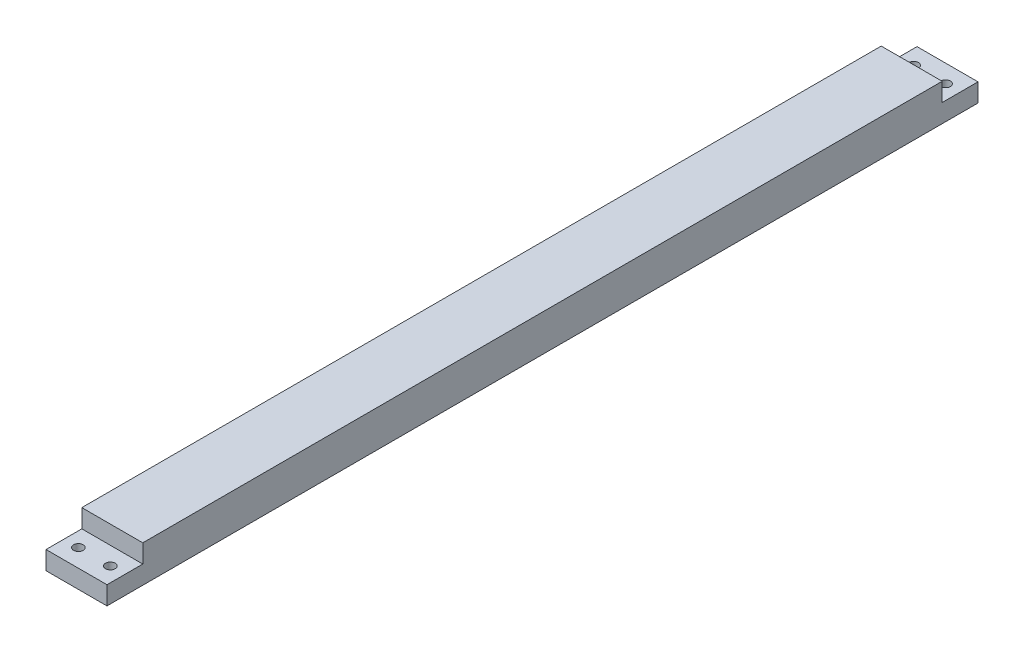
ISO-10303-21;
HEADER;
FILE_DESCRIPTION(('STEP AP214'),'2;1');
FILE_NAME('part.step','',(''),(''),'','','');
FILE_SCHEMA(('AUTOMOTIVE_DESIGN { 1 0 10303 214 1 1 1 1 }'));
ENDSEC;
DATA;
#1=APPLICATION_CONTEXT('core data for automotive mechanical design processes');
#2=APPLICATION_PROTOCOL_DEFINITION('international standard','automotive_design',2000,#1);
#3=PRODUCT_CONTEXT('',#1,'mechanical');
#4=PRODUCT('Part','Part','',(#3));
#5=PRODUCT_RELATED_PRODUCT_CATEGORY('part','',(#4));
#6=PRODUCT_DEFINITION_FORMATION('','',#4);
#7=PRODUCT_DEFINITION_CONTEXT('part definition',#1,'design');
#8=PRODUCT_DEFINITION('design','',#6,#7);
#9=PRODUCT_DEFINITION_SHAPE('','',#8);
#10=(LENGTH_UNIT() NAMED_UNIT(*) SI_UNIT(.MILLI.,.METRE.));
#11=(NAMED_UNIT(*) PLANE_ANGLE_UNIT() SI_UNIT($,.RADIAN.));
#12=(NAMED_UNIT(*) SI_UNIT($,.STERADIAN.) SOLID_ANGLE_UNIT());
#13=UNCERTAINTY_MEASURE_WITH_UNIT(LENGTH_MEASURE(1.E-05),#10,'distance_accuracy_value','');
#14=(GEOMETRIC_REPRESENTATION_CONTEXT(3) GLOBAL_UNCERTAINTY_ASSIGNED_CONTEXT((#13)) GLOBAL_UNIT_ASSIGNED_CONTEXT((#10,
#11,#12)) REPRESENTATION_CONTEXT('',''));
#15=CARTESIAN_POINT('',(0.,0.,0.));
#16=DIRECTION('',(0.,0.,1.));
#17=DIRECTION('',(1.,0.,0.));
#18=AXIS2_PLACEMENT_3D('',#15,#16,#17);
#19=CARTESIAN_POINT('',(0.,0.,900.));
#20=DIRECTION('',(1.,0.,0.));
#21=DIRECTION('',(0.,0.,-1.));
#22=AXIS2_PLACEMENT_3D('',#19,#20,#21);
#23=PLANE('',#22);
#24=DIRECTION('',(0.,-1.,0.));
#25=VECTOR('',#24,1.);
#26=CARTESIAN_POINT('',(0.,0.,900.));
#27=LINE('',#26,#25);
#28=CARTESIAN_POINT('',(0.,19.,900.));
#29=VERTEX_POINT('',#28);
#30=CARTESIAN_POINT('',(0.,0.,900.));
#31=VERTEX_POINT('',#30);
#32=EDGE_CURVE('E129',#29,#31,#27,.T.);
#33=ORIENTED_EDGE('',*,*,#32,.F.);
#34=DIRECTION('',(0.,0.,1.));
#35=VECTOR('',#34,1.);
#36=CARTESIAN_POINT('',(0.,19.,900.));
#37=LINE('',#36,#35);
#38=CARTESIAN_POINT('',(0.,19.,863.));
#39=VERTEX_POINT('',#38);
#40=EDGE_CURVE('E47',#39,#29,#37,.T.);
#41=ORIENTED_EDGE('',*,*,#40,.F.);
#42=DIRECTION('',(0.,-1.,0.));
#43=VECTOR('',#42,1.);
#44=CARTESIAN_POINT('',(0.,38.,863.));
#45=LINE('',#44,#43);
#46=CARTESIAN_POINT('',(0.,38.,863.));
#47=VERTEX_POINT('',#46);
#48=EDGE_CURVE('E157',#47,#39,#45,.T.);
#49=ORIENTED_EDGE('',*,*,#48,.F.);
#50=DIRECTION('',(0.,0.,-1.));
#51=VECTOR('',#50,1.);
#52=CARTESIAN_POINT('',(0.,38.,900.));
#53=LINE('',#52,#51);
#54=CARTESIAN_POINT('',(0.,38.,37.));
#55=VERTEX_POINT('',#54);
#56=EDGE_CURVE('E115',#47,#55,#53,.T.);
#57=ORIENTED_EDGE('',*,*,#56,.T.);
#58=DIRECTION('',(0.,1.,0.));
#59=VECTOR('',#58,1.);
#60=CARTESIAN_POINT('',(0.,38.,37.));
#61=LINE('',#60,#59);
#62=CARTESIAN_POINT('',(0.,19.,37.));
#63=VERTEX_POINT('',#62);
#64=EDGE_CURVE('E145',#63,#55,#61,.T.);
#65=ORIENTED_EDGE('',*,*,#64,.F.);
#66=DIRECTION('',(0.,0.,1.));
#67=VECTOR('',#66,1.);
#68=CARTESIAN_POINT('',(0.,19.,0.));
#69=LINE('',#68,#67);
#70=CARTESIAN_POINT('',(0.,19.,0.));
#71=VERTEX_POINT('',#70);
#72=EDGE_CURVE('E148',#71,#63,#69,.T.);
#73=ORIENTED_EDGE('',*,*,#72,.F.);
#74=DIRECTION('',(0.,-1.,0.));
#75=VECTOR('',#74,1.);
#76=CARTESIAN_POINT('',(0.,0.,0.));
#77=LINE('',#76,#75);
#78=CARTESIAN_POINT('',(0.,0.,0.));
#79=VERTEX_POINT('',#78);
#80=EDGE_CURVE('E132',#71,#79,#77,.T.);
#81=ORIENTED_EDGE('',*,*,#80,.T.);
#82=DIRECTION('',(0.,0.,-1.));
#83=VECTOR('',#82,1.);
#84=CARTESIAN_POINT('',(0.,0.,900.));
#85=LINE('',#84,#83);
#86=EDGE_CURVE('E11',#31,#79,#85,.T.);
#87=ORIENTED_EDGE('',*,*,#86,.F.);
#88=EDGE_LOOP('',(#33,#41,#49,#57,#65,#73,#81,#87));
#89=FACE_BOUND('',#88,.T.);
#90=ADVANCED_FACE('F33',(#89),#23,.F.);
#91=CARTESIAN_POINT('',(0.,0.,900.));
#92=DIRECTION('',(0.,1.,0.));
#93=DIRECTION('',(0.,0.,1.));
#94=AXIS2_PLACEMENT_3D('',#91,#92,#93);
#95=PLANE('',#94);
#96=CARTESIAN_POINT('',(48.,0.,18.5));
#97=DIRECTION('',(0.,1.,0.));
#98=DIRECTION('',(0.,0.,-1.));
#99=AXIS2_PLACEMENT_3D('',#96,#97,#98);
#100=CIRCLE('',#99,5.);
#101=CARTESIAN_POINT('',(48.,0.,13.5));
#102=VERTEX_POINT('',#101);
#103=EDGE_CURVE('E164',#102,#102,#100,.T.);
#104=ORIENTED_EDGE('',*,*,#103,.T.);
#105=EDGE_LOOP('',(#104));
#106=FACE_BOUND('',#105,.T.);
#107=CARTESIAN_POINT('',(47.9999999999999,0.,881.5));
#108=DIRECTION('',(0.,1.,0.));
#109=DIRECTION('',(0.,0.,1.));
#110=AXIS2_PLACEMENT_3D('',#107,#108,#109);
#111=CIRCLE('',#110,5.00000000000001);
#112=CARTESIAN_POINT('',(47.9999999999999,0.,886.5));
#113=VERTEX_POINT('',#112);
#114=EDGE_CURVE('E176',#113,#113,#111,.T.);
#115=ORIENTED_EDGE('',*,*,#114,.T.);
#116=EDGE_LOOP('',(#115));
#117=FACE_BOUND('',#116,.T.);
#118=CARTESIAN_POINT('',(15.0000000000001,0.,881.5));
#119=DIRECTION('',(0.,1.,0.));
#120=DIRECTION('',(0.,0.,-1.));
#121=AXIS2_PLACEMENT_3D('',#118,#119,#120);
#122=CIRCLE('',#121,5.00000000000001);
#123=CARTESIAN_POINT('',(15.0000000000001,0.,876.5));
#124=VERTEX_POINT('',#123);
#125=EDGE_CURVE('E170',#124,#124,#122,.T.);
#126=ORIENTED_EDGE('',*,*,#125,.T.);
#127=EDGE_LOOP('',(#126));
#128=FACE_BOUND('',#127,.T.);
#129=CARTESIAN_POINT('',(15.,0.,18.5));
#130=DIRECTION('',(0.,1.,0.));
#131=DIRECTION('',(0.,0.,1.));
#132=AXIS2_PLACEMENT_3D('',#129,#130,#131);
#133=CIRCLE('',#132,5.);
#134=CARTESIAN_POINT('',(15.,0.,23.5));
#135=VERTEX_POINT('',#134);
#136=EDGE_CURVE('E159',#135,#135,#133,.T.);
#137=ORIENTED_EDGE('',*,*,#136,.T.);
#138=EDGE_LOOP('',(#137));
#139=FACE_BOUND('',#138,.T.);
#140=DIRECTION('',(1.,0.,0.));
#141=VECTOR('',#140,1.);
#142=CARTESIAN_POINT('',(0.,0.,0.));
#143=LINE('',#142,#141);
#144=CARTESIAN_POINT('',(63.,0.,0.));
#145=VERTEX_POINT('',#144);
#146=EDGE_CURVE('E130',#79,#145,#143,.T.);
#147=ORIENTED_EDGE('',*,*,#146,.T.);
#148=DIRECTION('',(0.,0.,-1.));
#149=VECTOR('',#148,1.);
#150=CARTESIAN_POINT('',(63.,0.,900.));
#151=LINE('',#150,#149);
#152=CARTESIAN_POINT('',(63.,0.,900.));
#153=VERTEX_POINT('',#152);
#154=EDGE_CURVE('E40',#153,#145,#151,.T.);
#155=ORIENTED_EDGE('',*,*,#154,.F.);
#156=DIRECTION('',(1.,0.,0.));
#157=VECTOR('',#156,1.);
#158=CARTESIAN_POINT('',(0.,0.,900.));
#159=LINE('',#158,#157);
#160=EDGE_CURVE('E137',#31,#153,#159,.T.);
#161=ORIENTED_EDGE('',*,*,#160,.F.);
#162=ORIENTED_EDGE('',*,*,#86,.T.);
#163=EDGE_LOOP('',(#147,#155,#161,#162));
#164=FACE_BOUND('',#163,.T.);
#165=ADVANCED_FACE('F185',(#106,#117,#128,#139,#164),#95,.F.);
#166=CARTESIAN_POINT('',(63.,0.,900.));
#167=DIRECTION('',(-1.,0.,0.));
#168=DIRECTION('',(0.,0.,1.));
#169=AXIS2_PLACEMENT_3D('',#166,#167,#168);
#170=PLANE('',#169);
#171=DIRECTION('',(0.,-1.,0.));
#172=VECTOR('',#171,1.);
#173=CARTESIAN_POINT('',(63.,38.,863.));
#174=LINE('',#173,#172);
#175=CARTESIAN_POINT('',(63.,38.,863.));
#176=VERTEX_POINT('',#175);
#177=CARTESIAN_POINT('',(63.,19.,863.));
#178=VERTEX_POINT('',#177);
#179=EDGE_CURVE('E96',#176,#178,#174,.T.);
#180=ORIENTED_EDGE('',*,*,#179,.T.);
#181=DIRECTION('',(0.,0.,1.));
#182=VECTOR('',#181,1.);
#183=CARTESIAN_POINT('',(63.,19.,900.));
#184=LINE('',#183,#182);
#185=CARTESIAN_POINT('',(63.,19.,900.));
#186=VERTEX_POINT('',#185);
#187=EDGE_CURVE('E107',#178,#186,#184,.T.);
#188=ORIENTED_EDGE('',*,*,#187,.T.);
#189=DIRECTION('',(0.,1.,0.));
#190=VECTOR('',#189,1.);
#191=CARTESIAN_POINT('',(63.,0.,900.));
#192=LINE('',#191,#190);
#193=EDGE_CURVE('E123',#153,#186,#192,.T.);
#194=ORIENTED_EDGE('',*,*,#193,.F.);
#195=ORIENTED_EDGE('',*,*,#154,.T.);
#196=DIRECTION('',(0.,1.,0.));
#197=VECTOR('',#196,1.);
#198=CARTESIAN_POINT('',(63.,0.,0.));
#199=LINE('',#198,#197);
#200=CARTESIAN_POINT('',(63.,19.,0.));
#201=VERTEX_POINT('',#200);
#202=EDGE_CURVE('E126',#145,#201,#199,.T.);
#203=ORIENTED_EDGE('',*,*,#202,.T.);
#204=DIRECTION('',(0.,0.,1.));
#205=VECTOR('',#204,1.);
#206=CARTESIAN_POINT('',(63.,19.,0.));
#207=LINE('',#206,#205);
#208=CARTESIAN_POINT('',(63.,19.,37.));
#209=VERTEX_POINT('',#208);
#210=EDGE_CURVE('E55',#201,#209,#207,.T.);
#211=ORIENTED_EDGE('',*,*,#210,.T.);
#212=DIRECTION('',(0.,1.,0.));
#213=VECTOR('',#212,1.);
#214=CARTESIAN_POINT('',(63.,38.,37.));
#215=LINE('',#214,#213);
#216=CARTESIAN_POINT('',(63.,38.,37.));
#217=VERTEX_POINT('',#216);
#218=EDGE_CURVE('E120',#209,#217,#215,.T.);
#219=ORIENTED_EDGE('',*,*,#218,.T.);
#220=DIRECTION('',(0.,0.,-1.));
#221=VECTOR('',#220,1.);
#222=CARTESIAN_POINT('',(63.,38.,900.));
#223=LINE('',#222,#221);
#224=EDGE_CURVE('E113',#176,#217,#223,.T.);
#225=ORIENTED_EDGE('',*,*,#224,.F.);
#226=EDGE_LOOP('',(#180,#188,#194,#195,#203,#211,#219,#225));
#227=FACE_BOUND('',#226,.T.);
#228=ADVANCED_FACE('F118',(#227),#170,.F.);
#229=CARTESIAN_POINT('',(0.,38.,900.));
#230=DIRECTION('',(0.,-1.,0.));
#231=DIRECTION('',(0.,0.,-1.));
#232=AXIS2_PLACEMENT_3D('',#229,#230,#231);
#233=PLANE('',#232);
#234=ORIENTED_EDGE('',*,*,#56,.F.);
#235=DIRECTION('',(-1.,0.,0.));
#236=VECTOR('',#235,1.);
#237=CARTESIAN_POINT('',(63.,38.,863.));
#238=LINE('',#237,#236);
#239=EDGE_CURVE('E100',#176,#47,#238,.T.);
#240=ORIENTED_EDGE('',*,*,#239,.F.);
#241=ORIENTED_EDGE('',*,*,#224,.T.);
#242=DIRECTION('',(-1.,0.,0.));
#243=VECTOR('',#242,1.);
#244=CARTESIAN_POINT('',(63.,38.,37.));
#245=LINE('',#244,#243);
#246=EDGE_CURVE('E134',#217,#55,#245,.T.);
#247=ORIENTED_EDGE('',*,*,#246,.T.);
#248=EDGE_LOOP('',(#234,#240,#241,#247));
#249=FACE_BOUND('',#248,.T.);
#250=ADVANCED_FACE('F111',(#249),#233,.F.);
#251=CARTESIAN_POINT('',(0.,0.,900.));
#252=DIRECTION('',(0.,0.,-1.));
#253=DIRECTION('',(-1.,0.,0.));
#254=AXIS2_PLACEMENT_3D('',#251,#252,#253);
#255=PLANE('',#254);
#256=ORIENTED_EDGE('',*,*,#193,.T.);
#257=DIRECTION('',(-1.,0.,0.));
#258=VECTOR('',#257,1.);
#259=CARTESIAN_POINT('',(63.,19.,900.));
#260=LINE('',#259,#258);
#261=EDGE_CURVE('E151',#186,#29,#260,.T.);
#262=ORIENTED_EDGE('',*,*,#261,.T.);
#263=ORIENTED_EDGE('',*,*,#32,.T.);
#264=ORIENTED_EDGE('',*,*,#160,.T.);
#265=EDGE_LOOP('',(#256,#262,#263,#264));
#266=FACE_BOUND('',#265,.T.);
#267=ADVANCED_FACE('F218',(#266),#255,.F.);
#268=CARTESIAN_POINT('',(0.,0.,0.));
#269=DIRECTION('',(0.,0.,-1.));
#270=DIRECTION('',(-1.,0.,0.));
#271=AXIS2_PLACEMENT_3D('',#268,#269,#270);
#272=PLANE('',#271);
#273=DIRECTION('',(-1.,0.,0.));
#274=VECTOR('',#273,1.);
#275=CARTESIAN_POINT('',(63.,19.,0.));
#276=LINE('',#275,#274);
#277=EDGE_CURVE('E140',#201,#71,#276,.T.);
#278=ORIENTED_EDGE('',*,*,#277,.F.);
#279=ORIENTED_EDGE('',*,*,#202,.F.);
#280=ORIENTED_EDGE('',*,*,#146,.F.);
#281=ORIENTED_EDGE('',*,*,#80,.F.);
#282=EDGE_LOOP('',(#278,#279,#280,#281));
#283=FACE_BOUND('',#282,.T.);
#284=ADVANCED_FACE('F213',(#283),#272,.T.);
#285=CARTESIAN_POINT('',(63.,38.,37.));
#286=DIRECTION('',(0.,0.,1.));
#287=DIRECTION('',(0.,-1.,0.));
#288=AXIS2_PLACEMENT_3D('',#285,#286,#287);
#289=PLANE('',#288);
#290=ORIENTED_EDGE('',*,*,#64,.T.);
#291=ORIENTED_EDGE('',*,*,#246,.F.);
#292=ORIENTED_EDGE('',*,*,#218,.F.);
#293=DIRECTION('',(-1.,0.,0.));
#294=VECTOR('',#293,1.);
#295=CARTESIAN_POINT('',(63.,19.,37.));
#296=LINE('',#295,#294);
#297=EDGE_CURVE('E142',#209,#63,#296,.T.);
#298=ORIENTED_EDGE('',*,*,#297,.T.);
#299=EDGE_LOOP('',(#290,#291,#292,#298));
#300=FACE_BOUND('',#299,.T.);
#301=ADVANCED_FACE('F199',(#300),#289,.F.);
#302=CARTESIAN_POINT('',(63.,19.,0.));
#303=DIRECTION('',(0.,-1.,0.));
#304=DIRECTION('',(0.,0.,-1.));
#305=AXIS2_PLACEMENT_3D('',#302,#303,#304);
#306=PLANE('',#305);
#307=CARTESIAN_POINT('',(48.,19.,18.5));
#308=DIRECTION('',(0.,1.,0.));
#309=DIRECTION('',(0.,0.,-1.));
#310=AXIS2_PLACEMENT_3D('',#307,#308,#309);
#311=CIRCLE('',#310,5.);
#312=CARTESIAN_POINT('',(48.,19.,13.5));
#313=VERTEX_POINT('',#312);
#314=EDGE_CURVE('E179',#313,#313,#311,.T.);
#315=ORIENTED_EDGE('',*,*,#314,.F.);
#316=EDGE_LOOP('',(#315));
#317=FACE_BOUND('',#316,.T.);
#318=CARTESIAN_POINT('',(15.,19.,18.5));
#319=DIRECTION('',(0.,1.,0.));
#320=DIRECTION('',(0.,0.,1.));
#321=AXIS2_PLACEMENT_3D('',#318,#319,#320);
#322=CIRCLE('',#321,5.);
#323=CARTESIAN_POINT('',(15.,19.,23.5));
#324=VERTEX_POINT('',#323);
#325=EDGE_CURVE('E161',#324,#324,#322,.T.);
#326=ORIENTED_EDGE('',*,*,#325,.F.);
#327=EDGE_LOOP('',(#326));
#328=FACE_BOUND('',#327,.T.);
#329=ORIENTED_EDGE('',*,*,#72,.T.);
#330=ORIENTED_EDGE('',*,*,#297,.F.);
#331=ORIENTED_EDGE('',*,*,#210,.F.);
#332=ORIENTED_EDGE('',*,*,#277,.T.);
#333=EDGE_LOOP('',(#329,#330,#331,#332));
#334=FACE_BOUND('',#333,.T.);
#335=ADVANCED_FACE('F195',(#317,#328,#334),#306,.F.);
#336=CARTESIAN_POINT('',(63.,19.,900.));
#337=DIRECTION('',(0.,-1.,0.));
#338=DIRECTION('',(0.,0.,-1.));
#339=AXIS2_PLACEMENT_3D('',#336,#337,#338);
#340=PLANE('',#339);
#341=CARTESIAN_POINT('',(47.9999999999999,19.,881.5));
#342=DIRECTION('',(0.,1.,0.));
#343=DIRECTION('',(0.,0.,1.));
#344=AXIS2_PLACEMENT_3D('',#341,#342,#343);
#345=CIRCLE('',#344,5.00000000000001);
#346=CARTESIAN_POINT('',(47.9999999999999,19.,886.5));
#347=VERTEX_POINT('',#346);
#348=EDGE_CURVE('E173',#347,#347,#345,.T.);
#349=ORIENTED_EDGE('',*,*,#348,.F.);
#350=EDGE_LOOP('',(#349));
#351=FACE_BOUND('',#350,.T.);
#352=CARTESIAN_POINT('',(15.0000000000001,19.,881.5));
#353=DIRECTION('',(0.,1.,0.));
#354=DIRECTION('',(0.,0.,-1.));
#355=AXIS2_PLACEMENT_3D('',#352,#353,#354);
#356=CIRCLE('',#355,5.00000000000001);
#357=CARTESIAN_POINT('',(15.0000000000001,19.,876.5));
#358=VERTEX_POINT('',#357);
#359=EDGE_CURVE('E167',#358,#358,#356,.T.);
#360=ORIENTED_EDGE('',*,*,#359,.F.);
#361=EDGE_LOOP('',(#360));
#362=FACE_BOUND('',#361,.T.);
#363=ORIENTED_EDGE('',*,*,#40,.T.);
#364=ORIENTED_EDGE('',*,*,#261,.F.);
#365=ORIENTED_EDGE('',*,*,#187,.F.);
#366=DIRECTION('',(-1.,0.,0.));
#367=VECTOR('',#366,1.);
#368=CARTESIAN_POINT('',(63.,19.,863.));
#369=LINE('',#368,#367);
#370=EDGE_CURVE('E102',#178,#39,#369,.T.);
#371=ORIENTED_EDGE('',*,*,#370,.T.);
#372=EDGE_LOOP('',(#363,#364,#365,#371));
#373=FACE_BOUND('',#372,.T.);
#374=ADVANCED_FACE('F198',(#351,#362,#373),#340,.F.);
#375=CARTESIAN_POINT('',(63.,38.,863.));
#376=DIRECTION('',(0.,0.,-1.));
#377=DIRECTION('',(-1.,0.,0.));
#378=AXIS2_PLACEMENT_3D('',#375,#376,#377);
#379=PLANE('',#378);
#380=ORIENTED_EDGE('',*,*,#48,.T.);
#381=ORIENTED_EDGE('',*,*,#370,.F.);
#382=ORIENTED_EDGE('',*,*,#179,.F.);
#383=ORIENTED_EDGE('',*,*,#239,.T.);
#384=EDGE_LOOP('',(#380,#381,#382,#383));
#385=FACE_BOUND('',#384,.T.);
#386=ADVANCED_FACE('F99',(#385),#379,.F.);
#387=CARTESIAN_POINT('',(15.,0.,18.5));
#388=DIRECTION('',(0.,1.,0.));
#389=DIRECTION('',(0.,0.,1.));
#390=AXIS2_PLACEMENT_3D('',#387,#388,#389);
#391=CYLINDRICAL_SURFACE('',#390,5.);
#392=ORIENTED_EDGE('',*,*,#136,.F.);
#393=EDGE_LOOP('',(#392));
#394=FACE_BOUND('',#393,.T.);
#395=ORIENTED_EDGE('',*,*,#325,.T.);
#396=EDGE_LOOP('',(#395));
#397=FACE_BOUND('',#396,.T.);
#398=ADVANCED_FACE('F225',(#394,#397),#391,.F.);
#399=CARTESIAN_POINT('',(15.0000000000001,0.,881.5));
#400=DIRECTION('',(0.,1.,0.));
#401=DIRECTION('',(0.,0.,1.));
#402=AXIS2_PLACEMENT_3D('',#399,#400,#401);
#403=CYLINDRICAL_SURFACE('',#402,5.00000000000001);
#404=ORIENTED_EDGE('',*,*,#125,.F.);
#405=EDGE_LOOP('',(#404));
#406=FACE_BOUND('',#405,.T.);
#407=ORIENTED_EDGE('',*,*,#359,.T.);
#408=EDGE_LOOP('',(#407));
#409=FACE_BOUND('',#408,.T.);
#410=ADVANCED_FACE('F271',(#406,#409),#403,.F.);
#411=CARTESIAN_POINT('',(47.9999999999999,0.,881.5));
#412=DIRECTION('',(0.,1.,0.));
#413=DIRECTION('',(0.,0.,1.));
#414=AXIS2_PLACEMENT_3D('',#411,#412,#413);
#415=CYLINDRICAL_SURFACE('',#414,5.00000000000001);
#416=ORIENTED_EDGE('',*,*,#114,.F.);
#417=EDGE_LOOP('',(#416));
#418=FACE_BOUND('',#417,.T.);
#419=ORIENTED_EDGE('',*,*,#348,.T.);
#420=EDGE_LOOP('',(#419));
#421=FACE_BOUND('',#420,.T.);
#422=ADVANCED_FACE('F191',(#418,#421),#415,.F.);
#423=CARTESIAN_POINT('',(48.,0.,18.5));
#424=DIRECTION('',(0.,1.,0.));
#425=DIRECTION('',(0.,0.,1.));
#426=AXIS2_PLACEMENT_3D('',#423,#424,#425);
#427=CYLINDRICAL_SURFACE('',#426,5.);
#428=ORIENTED_EDGE('',*,*,#103,.F.);
#429=EDGE_LOOP('',(#428));
#430=FACE_BOUND('',#429,.T.);
#431=ORIENTED_EDGE('',*,*,#314,.T.);
#432=EDGE_LOOP('',(#431));
#433=FACE_BOUND('',#432,.T.);
#434=ADVANCED_FACE('F188',(#430,#433),#427,.F.);
#435=CLOSED_SHELL('',(#90,#165,#228,#250,#267,#284,#301,#335,#374,#386,#398,#410,#422,#434));
#436=MANIFOLD_SOLID_BREP('B2',#435);
#437=ADVANCED_BREP_SHAPE_REPRESENTATION('',(#18,#436),#14);
#438=SHAPE_DEFINITION_REPRESENTATION(#9,#437);
ENDSEC;
END-ISO-10303-21;
